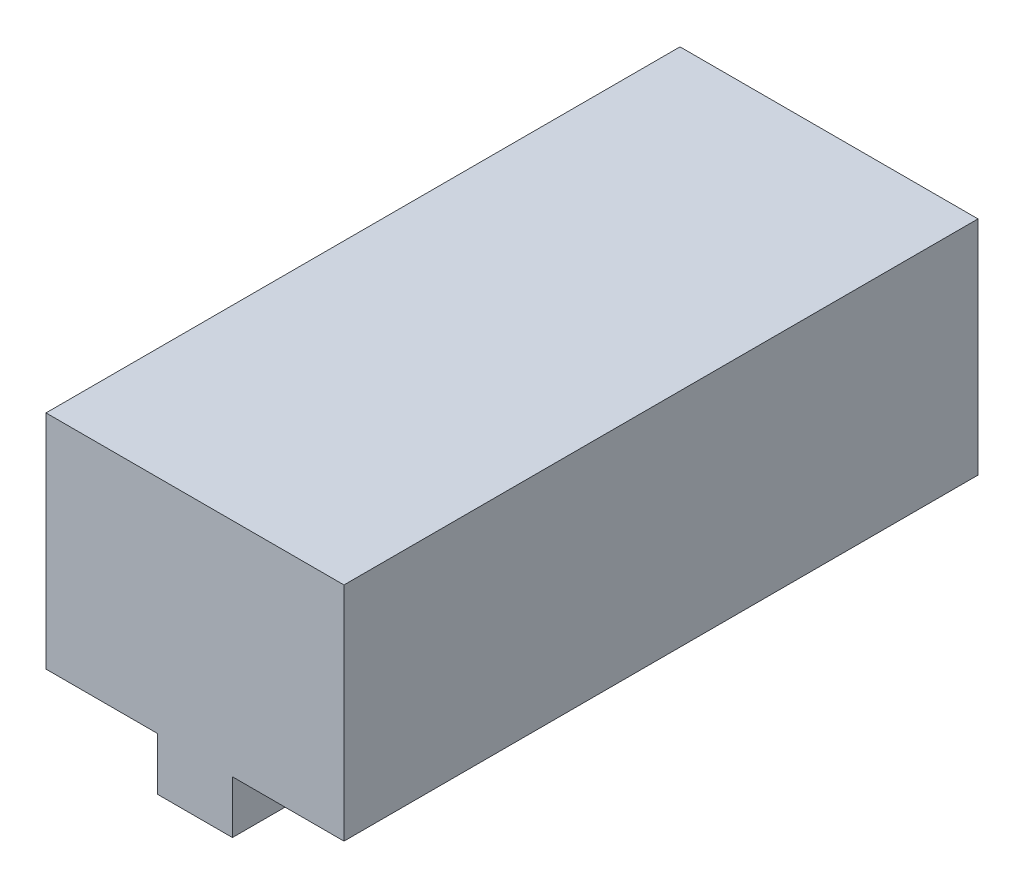
ISO-10303-21;
HEADER;
FILE_DESCRIPTION(('STEP AP214'),'2;1');
FILE_NAME('part.step','',(''),(''),'','','');
FILE_SCHEMA(('AUTOMOTIVE_DESIGN { 1 0 10303 214 1 1 1 1 }'));
ENDSEC;
DATA;
#1=APPLICATION_CONTEXT('core data for automotive mechanical design processes');
#2=APPLICATION_PROTOCOL_DEFINITION('international standard','automotive_design',2000,#1);
#3=PRODUCT_CONTEXT('',#1,'mechanical');
#4=PRODUCT('Part','Part','',(#3));
#5=PRODUCT_RELATED_PRODUCT_CATEGORY('part','',(#4));
#6=PRODUCT_DEFINITION_FORMATION('','',#4);
#7=PRODUCT_DEFINITION_CONTEXT('part definition',#1,'design');
#8=PRODUCT_DEFINITION('design','',#6,#7);
#9=PRODUCT_DEFINITION_SHAPE('','',#8);
#10=(LENGTH_UNIT() NAMED_UNIT(*) SI_UNIT(.MILLI.,.METRE.));
#11=(NAMED_UNIT(*) PLANE_ANGLE_UNIT() SI_UNIT($,.RADIAN.));
#12=(NAMED_UNIT(*) SI_UNIT($,.STERADIAN.) SOLID_ANGLE_UNIT());
#13=UNCERTAINTY_MEASURE_WITH_UNIT(LENGTH_MEASURE(1.E-05),#10,'distance_accuracy_value','');
#14=(GEOMETRIC_REPRESENTATION_CONTEXT(3) GLOBAL_UNCERTAINTY_ASSIGNED_CONTEXT((#13)) GLOBAL_UNIT_ASSIGNED_CONTEXT((#10,
#11,#12)) REPRESENTATION_CONTEXT('',''));
#15=CARTESIAN_POINT('',(0.,0.,0.));
#16=DIRECTION('',(0.,0.,1.));
#17=DIRECTION('',(1.,0.,0.));
#18=AXIS2_PLACEMENT_3D('',#15,#16,#17);
#19=CARTESIAN_POINT('',(0.,0.,-25.4));
#20=DIRECTION('',(1.,0.,0.));
#21=DIRECTION('',(0.,0.,-1.));
#22=AXIS2_PLACEMENT_3D('',#19,#20,#21);
#23=PLANE('',#22);
#24=DIRECTION('',(0.,1.,0.));
#25=VECTOR('',#24,1.);
#26=CARTESIAN_POINT('',(0.,0.,0.));
#27=LINE('',#26,#25);
#28=CARTESIAN_POINT('',(0.,0.,0.));
#29=VERTEX_POINT('',#28);
#30=CARTESIAN_POINT('',(0.,8.89,0.));
#31=VERTEX_POINT('',#30);
#32=EDGE_CURVE('E125',#29,#31,#27,.T.);
#33=ORIENTED_EDGE('',*,*,#32,.T.);
#34=DIRECTION('',(0.,0.,1.));
#35=VECTOR('',#34,1.);
#36=CARTESIAN_POINT('',(0.,8.89,-25.4));
#37=LINE('',#36,#35);
#38=CARTESIAN_POINT('',(0.,8.89,-25.4));
#39=VERTEX_POINT('',#38);
#40=EDGE_CURVE('E11',#39,#31,#37,.T.);
#41=ORIENTED_EDGE('',*,*,#40,.F.);
#42=DIRECTION('',(0.,1.,0.));
#43=VECTOR('',#42,1.);
#44=CARTESIAN_POINT('',(0.,0.,-25.4));
#45=LINE('',#44,#43);
#46=CARTESIAN_POINT('',(0.,0.,-25.4));
#47=VERTEX_POINT('',#46);
#48=EDGE_CURVE('E158',#47,#39,#45,.T.);
#49=ORIENTED_EDGE('',*,*,#48,.F.);
#50=DIRECTION('',(0.,0.,1.));
#51=VECTOR('',#50,1.);
#52=CARTESIAN_POINT('',(0.,0.,-25.4));
#53=LINE('',#52,#51);
#54=EDGE_CURVE('E60',#47,#29,#53,.T.);
#55=ORIENTED_EDGE('',*,*,#54,.T.);
#56=EDGE_LOOP('',(#33,#41,#49,#55));
#57=FACE_BOUND('',#56,.T.);
#58=ADVANCED_FACE('F36',(#57),#23,.F.);
#59=CARTESIAN_POINT('',(0.,8.89,-25.4));
#60=DIRECTION('',(0.,-1.,0.));
#61=DIRECTION('',(0.,0.,-1.));
#62=AXIS2_PLACEMENT_3D('',#59,#60,#61);
#63=PLANE('',#62);
#64=DIRECTION('',(1.,0.,0.));
#65=VECTOR('',#64,1.);
#66=CARTESIAN_POINT('',(0.,8.89,0.));
#67=LINE('',#66,#65);
#68=CARTESIAN_POINT('',(11.938,8.89,0.));
#69=VERTEX_POINT('',#68);
#70=EDGE_CURVE('E172',#31,#69,#67,.T.);
#71=ORIENTED_EDGE('',*,*,#70,.T.);
#72=DIRECTION('',(0.,0.,1.));
#73=VECTOR('',#72,1.);
#74=CARTESIAN_POINT('',(11.938,8.89,-25.4));
#75=LINE('',#74,#73);
#76=CARTESIAN_POINT('',(11.938,8.89,-25.4));
#77=VERTEX_POINT('',#76);
#78=EDGE_CURVE('E44',#77,#69,#75,.T.);
#79=ORIENTED_EDGE('',*,*,#78,.F.);
#80=DIRECTION('',(1.,0.,0.));
#81=VECTOR('',#80,1.);
#82=CARTESIAN_POINT('',(0.,8.89,-25.4));
#83=LINE('',#82,#81);
#84=EDGE_CURVE('E86',#39,#77,#83,.T.);
#85=ORIENTED_EDGE('',*,*,#84,.F.);
#86=ORIENTED_EDGE('',*,*,#40,.T.);
#87=EDGE_LOOP('',(#71,#79,#85,#86));
#88=FACE_BOUND('',#87,.T.);
#89=ADVANCED_FACE('F192',(#88),#63,.F.);
#90=CARTESIAN_POINT('',(11.938,0.,-25.4));
#91=DIRECTION('',(1.,0.,0.));
#92=DIRECTION('',(0.,0.,-1.));
#93=AXIS2_PLACEMENT_3D('',#90,#91,#92);
#94=PLANE('',#93);
#95=DIRECTION('',(0.,1.,0.));
#96=VECTOR('',#95,1.);
#97=CARTESIAN_POINT('',(11.938,0.,0.));
#98=LINE('',#97,#96);
#99=CARTESIAN_POINT('',(11.938,0.,0.));
#100=VERTEX_POINT('',#99);
#101=EDGE_CURVE('E176',#100,#69,#98,.T.);
#102=ORIENTED_EDGE('',*,*,#101,.F.);
#103=DIRECTION('',(0.,0.,1.));
#104=VECTOR('',#103,1.);
#105=CARTESIAN_POINT('',(11.938,0.,-25.4));
#106=LINE('',#105,#104);
#107=CARTESIAN_POINT('',(11.938,0.,-25.4));
#108=VERTEX_POINT('',#107);
#109=EDGE_CURVE('E185',#108,#100,#106,.T.);
#110=ORIENTED_EDGE('',*,*,#109,.F.);
#111=DIRECTION('',(0.,1.,0.));
#112=VECTOR('',#111,1.);
#113=CARTESIAN_POINT('',(11.938,0.,-25.4));
#114=LINE('',#113,#112);
#115=EDGE_CURVE('E164',#108,#77,#114,.T.);
#116=ORIENTED_EDGE('',*,*,#115,.T.);
#117=ORIENTED_EDGE('',*,*,#78,.T.);
#118=EDGE_LOOP('',(#102,#110,#116,#117));
#119=FACE_BOUND('',#118,.T.);
#120=ADVANCED_FACE('F190',(#119),#94,.T.);
#121=CARTESIAN_POINT('',(0.,0.,-25.4));
#122=DIRECTION('',(0.,-1.,0.));
#123=DIRECTION('',(0.,0.,-1.));
#124=AXIS2_PLACEMENT_3D('',#121,#122,#123);
#125=PLANE('',#124);
#126=DIRECTION('',(0.,0.,1.));
#127=VECTOR('',#126,1.);
#128=CARTESIAN_POINT('',(7.469,0.,-15.));
#129=LINE('',#128,#127);
#130=CARTESIAN_POINT('',(7.469,0.,-15.));
#131=VERTEX_POINT('',#130);
#132=CARTESIAN_POINT('',(7.469,0.,0.));
#133=VERTEX_POINT('',#132);
#134=EDGE_CURVE('E126',#131,#133,#129,.T.);
#135=ORIENTED_EDGE('',*,*,#134,.F.);
#136=DIRECTION('',(1.,0.,0.));
#137=VECTOR('',#136,1.);
#138=CARTESIAN_POINT('',(4.469,0.,-15.));
#139=LINE('',#138,#137);
#140=CARTESIAN_POINT('',(4.469,0.,-15.));
#141=VERTEX_POINT('',#140);
#142=EDGE_CURVE('E114',#141,#131,#139,.T.);
#143=ORIENTED_EDGE('',*,*,#142,.F.);
#144=DIRECTION('',(0.,0.,1.));
#145=VECTOR('',#144,1.);
#146=CARTESIAN_POINT('',(4.469,0.,-15.));
#147=LINE('',#146,#145);
#148=CARTESIAN_POINT('',(4.469,0.,0.));
#149=VERTEX_POINT('',#148);
#150=EDGE_CURVE('E121',#141,#149,#147,.T.);
#151=ORIENTED_EDGE('',*,*,#150,.T.);
#152=DIRECTION('',(1.,0.,0.));
#153=VECTOR('',#152,1.);
#154=CARTESIAN_POINT('',(0.,0.,0.));
#155=LINE('',#154,#153);
#156=EDGE_CURVE('E161',#29,#149,#155,.T.);
#157=ORIENTED_EDGE('',*,*,#156,.F.);
#158=ORIENTED_EDGE('',*,*,#54,.F.);
#159=DIRECTION('',(1.,0.,0.));
#160=VECTOR('',#159,1.);
#161=CARTESIAN_POINT('',(0.,0.,-25.4));
#162=LINE('',#161,#160);
#163=EDGE_CURVE('E167',#47,#108,#162,.T.);
#164=ORIENTED_EDGE('',*,*,#163,.T.);
#165=ORIENTED_EDGE('',*,*,#109,.T.);
#166=EDGE_CURVE('E180',#133,#100,#155,.T.);
#167=ORIENTED_EDGE('',*,*,#166,.F.);
#168=EDGE_LOOP('',(#135,#143,#151,#157,#158,#164,#165,#167));
#169=FACE_BOUND('',#168,.T.);
#170=ADVANCED_FACE('F129',(#169),#125,.T.);
#171=CARTESIAN_POINT('',(0.,0.,-25.4));
#172=DIRECTION('',(0.,0.,-1.));
#173=DIRECTION('',(-1.,0.,0.));
#174=AXIS2_PLACEMENT_3D('',#171,#172,#173);
#175=PLANE('',#174);
#176=ORIENTED_EDGE('',*,*,#48,.T.);
#177=ORIENTED_EDGE('',*,*,#84,.T.);
#178=ORIENTED_EDGE('',*,*,#115,.F.);
#179=ORIENTED_EDGE('',*,*,#163,.F.);
#180=EDGE_LOOP('',(#176,#177,#178,#179));
#181=FACE_BOUND('',#180,.T.);
#182=ADVANCED_FACE('F200',(#181),#175,.T.);
#183=CARTESIAN_POINT('',(0.,0.,0.));
#184=DIRECTION('',(0.,0.,-1.));
#185=DIRECTION('',(-1.,0.,0.));
#186=AXIS2_PLACEMENT_3D('',#183,#184,#185);
#187=PLANE('',#186);
#188=ORIENTED_EDGE('',*,*,#32,.F.);
#189=ORIENTED_EDGE('',*,*,#156,.T.);
#190=DIRECTION('',(0.,1.,0.));
#191=VECTOR('',#190,1.);
#192=CARTESIAN_POINT('',(4.469,-2.11,0.));
#193=LINE('',#192,#191);
#194=CARTESIAN_POINT('',(4.469,-2.11,0.));
#195=VERTEX_POINT('',#194);
#196=EDGE_CURVE('E51',#195,#149,#193,.T.);
#197=ORIENTED_EDGE('',*,*,#196,.F.);
#198=DIRECTION('',(1.,0.,0.));
#199=VECTOR('',#198,1.);
#200=CARTESIAN_POINT('',(4.469,-2.11,0.));
#201=LINE('',#200,#199);
#202=CARTESIAN_POINT('',(7.469,-2.11,0.));
#203=VERTEX_POINT('',#202);
#204=EDGE_CURVE('E119',#195,#203,#201,.T.);
#205=ORIENTED_EDGE('',*,*,#204,.T.);
#206=DIRECTION('',(0.,1.,0.));
#207=VECTOR('',#206,1.);
#208=CARTESIAN_POINT('',(7.469,-2.11,0.));
#209=LINE('',#208,#207);
#210=EDGE_CURVE('E144',#203,#133,#209,.T.);
#211=ORIENTED_EDGE('',*,*,#210,.T.);
#212=ORIENTED_EDGE('',*,*,#166,.T.);
#213=ORIENTED_EDGE('',*,*,#101,.T.);
#214=ORIENTED_EDGE('',*,*,#70,.F.);
#215=EDGE_LOOP('',(#188,#189,#197,#205,#211,#212,#213,#214));
#216=FACE_BOUND('',#215,.T.);
#217=ADVANCED_FACE('F195',(#216),#187,.F.);
#218=CARTESIAN_POINT('',(4.469,-2.11,-15.));
#219=DIRECTION('',(1.,0.,0.));
#220=DIRECTION('',(0.,0.,-1.));
#221=AXIS2_PLACEMENT_3D('',#218,#219,#220);
#222=PLANE('',#221);
#223=ORIENTED_EDGE('',*,*,#196,.T.);
#224=ORIENTED_EDGE('',*,*,#150,.F.);
#225=DIRECTION('',(0.,1.,0.));
#226=VECTOR('',#225,1.);
#227=CARTESIAN_POINT('',(4.469,-2.11,-15.));
#228=LINE('',#227,#226);
#229=CARTESIAN_POINT('',(4.469,-2.11,-15.));
#230=VERTEX_POINT('',#229);
#231=EDGE_CURVE('E110',#230,#141,#228,.T.);
#232=ORIENTED_EDGE('',*,*,#231,.F.);
#233=DIRECTION('',(0.,0.,1.));
#234=VECTOR('',#233,1.);
#235=CARTESIAN_POINT('',(4.469,-2.11,-15.));
#236=LINE('',#235,#234);
#237=EDGE_CURVE('E141',#230,#195,#236,.T.);
#238=ORIENTED_EDGE('',*,*,#237,.T.);
#239=EDGE_LOOP('',(#223,#224,#232,#238));
#240=FACE_BOUND('',#239,.T.);
#241=ADVANCED_FACE('F122',(#240),#222,.F.);
#242=CARTESIAN_POINT('',(7.469,-2.11,-15.));
#243=DIRECTION('',(1.,0.,0.));
#244=DIRECTION('',(0.,1.,0.));
#245=AXIS2_PLACEMENT_3D('',#242,#243,#244);
#246=PLANE('',#245);
#247=ORIENTED_EDGE('',*,*,#210,.F.);
#248=DIRECTION('',(0.,0.,1.));
#249=VECTOR('',#248,1.);
#250=CARTESIAN_POINT('',(7.469,-2.11,-15.));
#251=LINE('',#250,#249);
#252=CARTESIAN_POINT('',(7.469,-2.11,-15.));
#253=VERTEX_POINT('',#252);
#254=EDGE_CURVE('E153',#253,#203,#251,.T.);
#255=ORIENTED_EDGE('',*,*,#254,.F.);
#256=DIRECTION('',(0.,1.,0.));
#257=VECTOR('',#256,1.);
#258=CARTESIAN_POINT('',(7.469,-2.11,-15.));
#259=LINE('',#258,#257);
#260=EDGE_CURVE('E132',#253,#131,#259,.T.);
#261=ORIENTED_EDGE('',*,*,#260,.T.);
#262=ORIENTED_EDGE('',*,*,#134,.T.);
#263=EDGE_LOOP('',(#247,#255,#261,#262));
#264=FACE_BOUND('',#263,.T.);
#265=ADVANCED_FACE('F205',(#264),#246,.T.);
#266=CARTESIAN_POINT('',(4.469,-2.11,-15.));
#267=DIRECTION('',(0.,-1.,0.));
#268=DIRECTION('',(1.,0.,0.));
#269=AXIS2_PLACEMENT_3D('',#266,#267,#268);
#270=PLANE('',#269);
#271=ORIENTED_EDGE('',*,*,#204,.F.);
#272=ORIENTED_EDGE('',*,*,#237,.F.);
#273=DIRECTION('',(1.,0.,0.));
#274=VECTOR('',#273,1.);
#275=CARTESIAN_POINT('',(4.469,-2.11,-15.));
#276=LINE('',#275,#274);
#277=EDGE_CURVE('E117',#230,#253,#276,.T.);
#278=ORIENTED_EDGE('',*,*,#277,.T.);
#279=ORIENTED_EDGE('',*,*,#254,.T.);
#280=EDGE_LOOP('',(#271,#272,#278,#279));
#281=FACE_BOUND('',#280,.T.);
#282=ADVANCED_FACE('F203',(#281),#270,.T.);
#283=CARTESIAN_POINT('',(0.,0.,-15.));
#284=DIRECTION('',(0.,0.,-1.));
#285=DIRECTION('',(-1.,0.,0.));
#286=AXIS2_PLACEMENT_3D('',#283,#284,#285);
#287=PLANE('',#286);
#288=ORIENTED_EDGE('',*,*,#231,.T.);
#289=ORIENTED_EDGE('',*,*,#142,.T.);
#290=ORIENTED_EDGE('',*,*,#260,.F.);
#291=ORIENTED_EDGE('',*,*,#277,.F.);
#292=EDGE_LOOP('',(#288,#289,#290,#291));
#293=FACE_BOUND('',#292,.T.);
#294=ADVANCED_FACE('F111',(#293),#287,.T.);
#295=CLOSED_SHELL('',(#58,#89,#120,#170,#182,#217,#241,#265,#282,#294));
#296=MANIFOLD_SOLID_BREP('B2',#295);
#297=ADVANCED_BREP_SHAPE_REPRESENTATION('',(#18,#296),#14);
#298=SHAPE_DEFINITION_REPRESENTATION(#9,#297);
ENDSEC;
END-ISO-10303-21;
